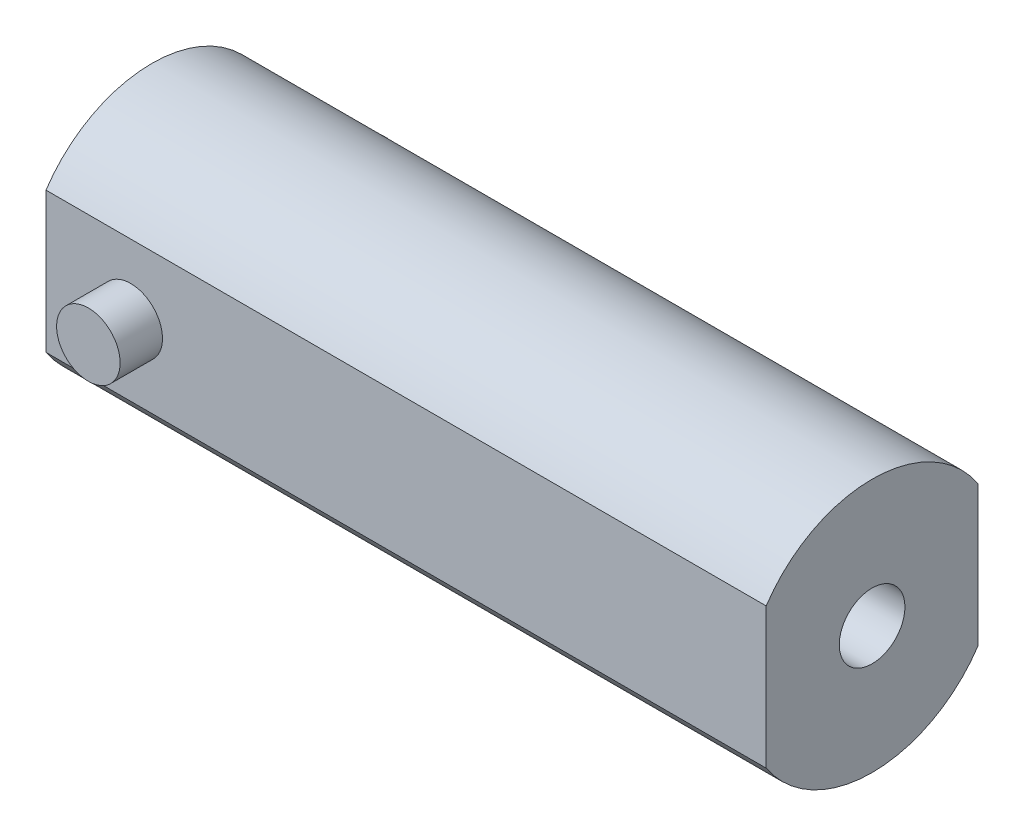
ISO-10303-21;
HEADER;
FILE_DESCRIPTION(('STEP AP214'),'2;1');
FILE_NAME('part.step','',(''),(''),'','','');
FILE_SCHEMA(('AUTOMOTIVE_DESIGN { 1 0 10303 214 1 1 1 1 }'));
ENDSEC;
DATA;
#1=APPLICATION_CONTEXT('core data for automotive mechanical design processes');
#2=APPLICATION_PROTOCOL_DEFINITION('international standard','automotive_design',2000,#1);
#3=PRODUCT_CONTEXT('',#1,'mechanical');
#4=PRODUCT('Part','Part','',(#3));
#5=PRODUCT_RELATED_PRODUCT_CATEGORY('part','',(#4));
#6=PRODUCT_DEFINITION_FORMATION('','',#4);
#7=PRODUCT_DEFINITION_CONTEXT('part definition',#1,'design');
#8=PRODUCT_DEFINITION('design','',#6,#7);
#9=PRODUCT_DEFINITION_SHAPE('','',#8);
#10=(LENGTH_UNIT() NAMED_UNIT(*) SI_UNIT(.MILLI.,.METRE.));
#11=(NAMED_UNIT(*) PLANE_ANGLE_UNIT() SI_UNIT($,.RADIAN.));
#12=(NAMED_UNIT(*) SI_UNIT($,.STERADIAN.) SOLID_ANGLE_UNIT());
#13=UNCERTAINTY_MEASURE_WITH_UNIT(LENGTH_MEASURE(1.E-05),#10,'distance_accuracy_value','');
#14=(GEOMETRIC_REPRESENTATION_CONTEXT(3) GLOBAL_UNCERTAINTY_ASSIGNED_CONTEXT((#13)) GLOBAL_UNIT_ASSIGNED_CONTEXT((#10,
#11,#12)) REPRESENTATION_CONTEXT('',''));
#15=CARTESIAN_POINT('',(0.,0.,0.));
#16=DIRECTION('',(0.,0.,1.));
#17=DIRECTION('',(1.,0.,0.));
#18=AXIS2_PLACEMENT_3D('',#15,#16,#17);
#19=CARTESIAN_POINT('',(170.,0.,0.));
#20=DIRECTION('',(-1.,0.,0.));
#21=DIRECTION('',(0.,0.,1.));
#22=AXIS2_PLACEMENT_3D('',#19,#20,#21);
#23=CYLINDRICAL_SURFACE('',#22,30.);
#24=CARTESIAN_POINT('',(0.,0.,0.));
#25=DIRECTION('',(1.,0.,0.));
#26=DIRECTION('',(0.,0.,-1.));
#27=AXIS2_PLACEMENT_3D('',#24,#25,#26);
#28=CIRCLE('',#27,30.);
#29=CARTESIAN_POINT('',(0.,-16.583123951777,25.));
#30=VERTEX_POINT('',#29);
#31=CARTESIAN_POINT('',(0.,-16.583123951777,-25.));
#32=VERTEX_POINT('',#31);
#33=EDGE_CURVE('E101',#30,#32,#28,.T.);
#34=ORIENTED_EDGE('',*,*,#33,.T.);
#35=DIRECTION('',(-1.,0.,0.));
#36=VECTOR('',#35,1.);
#37=CARTESIAN_POINT('',(170.,-16.583123951777,-25.));
#38=LINE('',#37,#36);
#39=CARTESIAN_POINT('',(170.,-16.583123951777,-25.));
#40=VERTEX_POINT('',#39);
#41=EDGE_CURVE('E43',#40,#32,#38,.T.);
#42=ORIENTED_EDGE('',*,*,#41,.F.);
#43=CARTESIAN_POINT('',(170.,0.,0.));
#44=DIRECTION('',(1.,0.,0.));
#45=DIRECTION('',(0.,0.,-1.));
#46=AXIS2_PLACEMENT_3D('',#43,#44,#45);
#47=CIRCLE('',#46,30.);
#48=CARTESIAN_POINT('',(170.,-16.583123951777,25.));
#49=VERTEX_POINT('',#48);
#50=EDGE_CURVE('E87',#49,#40,#47,.T.);
#51=ORIENTED_EDGE('',*,*,#50,.F.);
#52=DIRECTION('',(-1.,0.,0.));
#53=VECTOR('',#52,1.);
#54=CARTESIAN_POINT('',(170.,-16.583123951777,25.));
#55=LINE('',#54,#53);
#56=EDGE_CURVE('E97',#49,#30,#55,.T.);
#57=ORIENTED_EDGE('',*,*,#56,.T.);
#58=EDGE_LOOP('',(#34,#42,#51,#57));
#59=FACE_BOUND('',#58,.T.);
#60=ADVANCED_FACE('F35',(#59),#23,.T.);
#61=CARTESIAN_POINT('',(170.,16.583123951777,-25.));
#62=DIRECTION('',(0.,0.,1.));
#63=DIRECTION('',(1.,0.,0.));
#64=AXIS2_PLACEMENT_3D('',#61,#62,#63);
#65=PLANE('',#64);
#66=CARTESIAN_POINT('',(20.,0.,-25.));
#67=DIRECTION('',(0.,0.,1.));
#68=DIRECTION('',(1.,0.,0.));
#69=AXIS2_PLACEMENT_3D('',#66,#67,#68);
#70=CIRCLE('',#69,7.5);
#71=CARTESIAN_POINT('',(27.5,0.,-25.));
#72=VERTEX_POINT('',#71);
#73=EDGE_CURVE('E198',#72,#72,#70,.T.);
#74=ORIENTED_EDGE('',*,*,#73,.T.);
#75=EDGE_LOOP('',(#74));
#76=FACE_BOUND('',#75,.T.);
#77=DIRECTION('',(0.,1.,0.));
#78=VECTOR('',#77,1.);
#79=CARTESIAN_POINT('',(0.,16.583123951777,-25.));
#80=LINE('',#79,#78);
#81=CARTESIAN_POINT('',(0.,16.583123951777,-25.));
#82=VERTEX_POINT('',#81);
#83=EDGE_CURVE('E92',#32,#82,#80,.T.);
#84=ORIENTED_EDGE('',*,*,#83,.T.);
#85=DIRECTION('',(-1.,0.,0.));
#86=VECTOR('',#85,1.);
#87=CARTESIAN_POINT('',(170.,16.583123951777,-25.));
#88=LINE('',#87,#86);
#89=CARTESIAN_POINT('',(170.,16.583123951777,-25.));
#90=VERTEX_POINT('',#89);
#91=EDGE_CURVE('E90',#90,#82,#88,.T.);
#92=ORIENTED_EDGE('',*,*,#91,.F.);
#93=DIRECTION('',(0.,1.,0.));
#94=VECTOR('',#93,1.);
#95=CARTESIAN_POINT('',(170.,16.583123951777,-25.));
#96=LINE('',#95,#94);
#97=EDGE_CURVE('E82',#40,#90,#96,.T.);
#98=ORIENTED_EDGE('',*,*,#97,.F.);
#99=ORIENTED_EDGE('',*,*,#41,.T.);
#100=EDGE_LOOP('',(#84,#92,#98,#99));
#101=FACE_BOUND('',#100,.T.);
#102=ADVANCED_FACE('F91',(#76,#101),#65,.F.);
#103=CARTESIAN_POINT('',(170.,0.,0.));
#104=DIRECTION('',(-1.,0.,0.));
#105=DIRECTION('',(0.,0.,1.));
#106=AXIS2_PLACEMENT_3D('',#103,#104,#105);
#107=CYLINDRICAL_SURFACE('',#106,30.);
#108=CARTESIAN_POINT('',(0.,0.,0.));
#109=DIRECTION('',(1.,0.,0.));
#110=DIRECTION('',(0.,0.,-1.));
#111=AXIS2_PLACEMENT_3D('',#108,#109,#110);
#112=CIRCLE('',#111,30.);
#113=CARTESIAN_POINT('',(0.,16.583123951777,25.));
#114=VERTEX_POINT('',#113);
#115=EDGE_CURVE('E68',#82,#114,#112,.T.);
#116=ORIENTED_EDGE('',*,*,#115,.T.);
#117=DIRECTION('',(-1.,0.,0.));
#118=VECTOR('',#117,1.);
#119=CARTESIAN_POINT('',(170.,16.583123951777,25.));
#120=LINE('',#119,#118);
#121=CARTESIAN_POINT('',(170.,16.583123951777,25.));
#122=VERTEX_POINT('',#121);
#123=EDGE_CURVE('E93',#122,#114,#120,.T.);
#124=ORIENTED_EDGE('',*,*,#123,.F.);
#125=CARTESIAN_POINT('',(170.,0.,0.));
#126=DIRECTION('',(1.,0.,0.));
#127=DIRECTION('',(0.,0.,-1.));
#128=AXIS2_PLACEMENT_3D('',#125,#126,#127);
#129=CIRCLE('',#128,30.);
#130=EDGE_CURVE('E85',#90,#122,#129,.T.);
#131=ORIENTED_EDGE('',*,*,#130,.F.);
#132=ORIENTED_EDGE('',*,*,#91,.T.);
#133=EDGE_LOOP('',(#116,#124,#131,#132));
#134=FACE_BOUND('',#133,.T.);
#135=ADVANCED_FACE('F95',(#134),#107,.T.);
#136=CARTESIAN_POINT('',(170.,16.583123951777,25.));
#137=DIRECTION('',(0.,0.,-1.));
#138=DIRECTION('',(-1.,0.,0.));
#139=AXIS2_PLACEMENT_3D('',#136,#137,#138);
#140=PLANE('',#139);
#141=CARTESIAN_POINT('',(20.,0.,25.));
#142=DIRECTION('',(0.,0.,-1.));
#143=DIRECTION('',(-1.,0.,0.));
#144=AXIS2_PLACEMENT_3D('',#141,#142,#143);
#145=CIRCLE('',#144,7.5);
#146=CARTESIAN_POINT('',(12.5,0.,25.));
#147=VERTEX_POINT('',#146);
#148=EDGE_CURVE('E11',#147,#147,#145,.F.);
#149=ORIENTED_EDGE('',*,*,#148,.F.);
#150=EDGE_LOOP('',(#149));
#151=FACE_BOUND('',#150,.T.);
#152=DIRECTION('',(0.,-1.,0.));
#153=VECTOR('',#152,1.);
#154=CARTESIAN_POINT('',(0.,16.583123951777,25.));
#155=LINE('',#154,#153);
#156=EDGE_CURVE('E74',#114,#30,#155,.T.);
#157=ORIENTED_EDGE('',*,*,#156,.T.);
#158=ORIENTED_EDGE('',*,*,#56,.F.);
#159=DIRECTION('',(0.,-1.,0.));
#160=VECTOR('',#159,1.);
#161=CARTESIAN_POINT('',(170.,16.583123951777,25.));
#162=LINE('',#161,#160);
#163=EDGE_CURVE('E51',#122,#49,#162,.T.);
#164=ORIENTED_EDGE('',*,*,#163,.F.);
#165=ORIENTED_EDGE('',*,*,#123,.T.);
#166=EDGE_LOOP('',(#157,#158,#164,#165));
#167=FACE_BOUND('',#166,.T.);
#168=ADVANCED_FACE('F123',(#151,#167),#140,.F.);
#169=CARTESIAN_POINT('',(170.,0.,0.));
#170=DIRECTION('',(1.,0.,0.));
#171=DIRECTION('',(0.,0.,-1.));
#172=AXIS2_PLACEMENT_3D('',#169,#170,#171);
#173=PLANE('',#172);
#174=CARTESIAN_POINT('',(170.,0.,0.));
#175=DIRECTION('',(1.,0.,0.));
#176=DIRECTION('',(0.,0.,-1.));
#177=AXIS2_PLACEMENT_3D('',#174,#175,#176);
#178=CIRCLE('',#177,7.75);
#179=CARTESIAN_POINT('',(170.,0.,-7.75));
#180=VERTEX_POINT('',#179);
#181=EDGE_CURVE('E203',#180,#180,#178,.T.);
#182=ORIENTED_EDGE('',*,*,#181,.F.);
#183=EDGE_LOOP('',(#182));
#184=FACE_BOUND('',#183,.T.);
#185=ORIENTED_EDGE('',*,*,#50,.T.);
#186=ORIENTED_EDGE('',*,*,#97,.T.);
#187=ORIENTED_EDGE('',*,*,#130,.T.);
#188=ORIENTED_EDGE('',*,*,#163,.T.);
#189=EDGE_LOOP('',(#185,#186,#187,#188));
#190=FACE_BOUND('',#189,.T.);
#191=ADVANCED_FACE('F83',(#184,#190),#173,.T.);
#192=CARTESIAN_POINT('',(0.,0.,0.));
#193=DIRECTION('',(1.,0.,0.));
#194=DIRECTION('',(0.,0.,-1.));
#195=AXIS2_PLACEMENT_3D('',#192,#193,#194);
#196=PLANE('',#195);
#197=ORIENTED_EDGE('',*,*,#33,.F.);
#198=ORIENTED_EDGE('',*,*,#156,.F.);
#199=ORIENTED_EDGE('',*,*,#115,.F.);
#200=ORIENTED_EDGE('',*,*,#83,.F.);
#201=EDGE_LOOP('',(#197,#198,#199,#200));
#202=FACE_BOUND('',#201,.T.);
#203=ADVANCED_FACE('F112',(#202),#196,.F.);
#204=CARTESIAN_POINT('',(20.,0.,35.));
#205=DIRECTION('',(0.,0.,-1.));
#206=DIRECTION('',(-1.,0.,0.));
#207=AXIS2_PLACEMENT_3D('',#204,#205,#206);
#208=CYLINDRICAL_SURFACE('',#207,7.5);
#209=CARTESIAN_POINT('',(20.,0.,35.));
#210=DIRECTION('',(0.,0.,1.));
#211=DIRECTION('',(1.,0.,0.));
#212=AXIS2_PLACEMENT_3D('',#209,#210,#211);
#213=CIRCLE('',#212,7.5);
#214=CARTESIAN_POINT('',(27.5,0.,35.));
#215=VERTEX_POINT('',#214);
#216=EDGE_CURVE('E104',#215,#215,#213,.T.);
#217=ORIENTED_EDGE('',*,*,#216,.F.);
#218=EDGE_LOOP('',(#217));
#219=FACE_BOUND('',#218,.T.);
#220=ORIENTED_EDGE('',*,*,#148,.T.);
#221=EDGE_LOOP('',(#220));
#222=FACE_BOUND('',#221,.T.);
#223=ADVANCED_FACE('F114',(#219,#222),#208,.T.);
#224=CARTESIAN_POINT('',(20.,0.,35.));
#225=DIRECTION('',(0.,0.,1.));
#226=DIRECTION('',(1.,0.,0.));
#227=AXIS2_PLACEMENT_3D('',#224,#225,#226);
#228=PLANE('',#227);
#229=ORIENTED_EDGE('',*,*,#216,.T.);
#230=EDGE_LOOP('',(#229));
#231=FACE_BOUND('',#230,.T.);
#232=ADVANCED_FACE('F120',(#231),#228,.T.);
#233=CARTESIAN_POINT('',(20.,0.,-35.));
#234=DIRECTION('',(0.,0.,1.));
#235=DIRECTION('',(1.,0.,0.));
#236=AXIS2_PLACEMENT_3D('',#233,#234,#235);
#237=CYLINDRICAL_SURFACE('',#236,7.5);
#238=CARTESIAN_POINT('',(20.,0.,-35.));
#239=DIRECTION('',(0.,0.,1.));
#240=DIRECTION('',(1.,0.,0.));
#241=AXIS2_PLACEMENT_3D('',#238,#239,#240);
#242=CIRCLE('',#241,7.5);
#243=CARTESIAN_POINT('',(27.5,0.,-35.));
#244=VERTEX_POINT('',#243);
#245=EDGE_CURVE('E195',#244,#244,#242,.T.);
#246=ORIENTED_EDGE('',*,*,#245,.T.);
#247=EDGE_LOOP('',(#246));
#248=FACE_BOUND('',#247,.T.);
#249=ORIENTED_EDGE('',*,*,#73,.F.);
#250=EDGE_LOOP('',(#249));
#251=FACE_BOUND('',#250,.T.);
#252=ADVANCED_FACE('F184',(#248,#251),#237,.T.);
#253=CARTESIAN_POINT('',(20.,0.,-35.));
#254=DIRECTION('',(0.,0.,-1.));
#255=DIRECTION('',(1.,0.,0.));
#256=AXIS2_PLACEMENT_3D('',#253,#254,#255);
#257=PLANE('',#256);
#258=ORIENTED_EDGE('',*,*,#245,.F.);
#259=EDGE_LOOP('',(#258));
#260=FACE_BOUND('',#259,.T.);
#261=ADVANCED_FACE('F157',(#260),#257,.T.);
#262=CARTESIAN_POINT('',(153.,0.,0.));
#263=DIRECTION('',(1.,0.,0.));
#264=DIRECTION('',(0.,0.,-1.));
#265=AXIS2_PLACEMENT_3D('',#262,#263,#264);
#266=CYLINDRICAL_SURFACE('',#265,7.75);
#267=CARTESIAN_POINT('',(153.,0.,0.));
#268=DIRECTION('',(1.,0.,0.));
#269=DIRECTION('',(0.,0.,-1.));
#270=AXIS2_PLACEMENT_3D('',#267,#268,#269);
#271=CIRCLE('',#270,7.75);
#272=CARTESIAN_POINT('',(153.,0.,-7.75));
#273=VERTEX_POINT('',#272);
#274=EDGE_CURVE('E201',#273,#273,#271,.T.);
#275=ORIENTED_EDGE('',*,*,#274,.F.);
#276=EDGE_LOOP('',(#275));
#277=FACE_BOUND('',#276,.T.);
#278=ORIENTED_EDGE('',*,*,#181,.T.);
#279=EDGE_LOOP('',(#278));
#280=FACE_BOUND('',#279,.T.);
#281=ADVANCED_FACE('F162',(#277,#280),#266,.F.);
#282=CARTESIAN_POINT('',(153.,0.,0.));
#283=DIRECTION('',(1.,0.,0.));
#284=DIRECTION('',(0.,0.,-1.));
#285=AXIS2_PLACEMENT_3D('',#282,#283,#284);
#286=PLANE('',#285);
#287=ORIENTED_EDGE('',*,*,#274,.T.);
#288=EDGE_LOOP('',(#287));
#289=FACE_BOUND('',#288,.T.);
#290=ADVANCED_FACE('F167',(#289),#286,.T.);
#291=CLOSED_SHELL('',(#60,#102,#135,#168,#191,#203,#223,#232,#252,#261,#281,#290));
#292=MANIFOLD_SOLID_BREP('B2',#291);
#293=ADVANCED_BREP_SHAPE_REPRESENTATION('',(#18,#292),#14);
#294=SHAPE_DEFINITION_REPRESENTATION(#9,#293);
ENDSEC;
END-ISO-10303-21;
